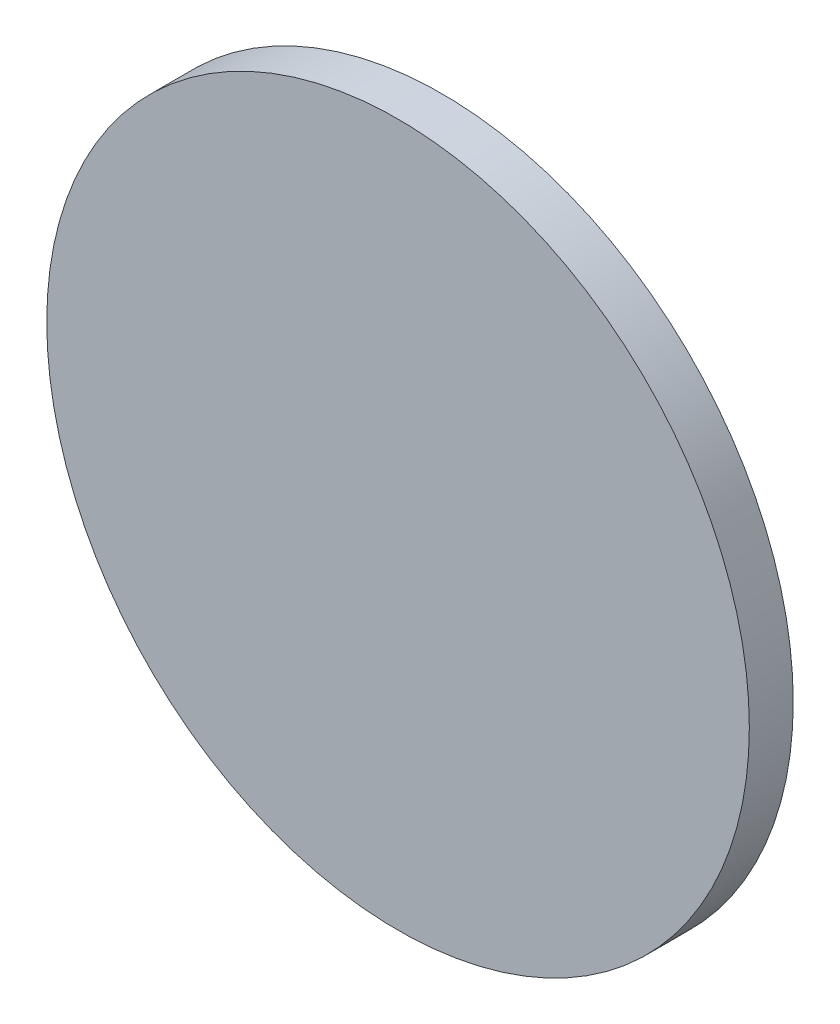
ISO-10303-21;
HEADER;
FILE_DESCRIPTION(('STEP AP214'),'2;1');
FILE_NAME('part.step','',(''),(''),'','','');
FILE_SCHEMA(('AUTOMOTIVE_DESIGN { 1 0 10303 214 1 1 1 1 }'));
ENDSEC;
DATA;
#1=APPLICATION_CONTEXT('core data for automotive mechanical design processes');
#2=APPLICATION_PROTOCOL_DEFINITION('international standard','automotive_design',2000,#1);
#3=PRODUCT_CONTEXT('',#1,'mechanical');
#4=PRODUCT('Part','Part','',(#3));
#5=PRODUCT_RELATED_PRODUCT_CATEGORY('part','',(#4));
#6=PRODUCT_DEFINITION_FORMATION('','',#4);
#7=PRODUCT_DEFINITION_CONTEXT('part definition',#1,'design');
#8=PRODUCT_DEFINITION('design','',#6,#7);
#9=PRODUCT_DEFINITION_SHAPE('','',#8);
#10=(LENGTH_UNIT() NAMED_UNIT(*) SI_UNIT(.MILLI.,.METRE.));
#11=(NAMED_UNIT(*) PLANE_ANGLE_UNIT() SI_UNIT($,.RADIAN.));
#12=(NAMED_UNIT(*) SI_UNIT($,.STERADIAN.) SOLID_ANGLE_UNIT());
#13=UNCERTAINTY_MEASURE_WITH_UNIT(LENGTH_MEASURE(1.E-05),#10,'distance_accuracy_value','');
#14=(GEOMETRIC_REPRESENTATION_CONTEXT(3) GLOBAL_UNCERTAINTY_ASSIGNED_CONTEXT((#13)) GLOBAL_UNIT_ASSIGNED_CONTEXT((#10,
#11,#12)) REPRESENTATION_CONTEXT('',''));
#15=CARTESIAN_POINT('',(0.,0.,0.));
#16=DIRECTION('',(0.,0.,1.));
#17=DIRECTION('',(1.,0.,0.));
#18=AXIS2_PLACEMENT_3D('',#15,#16,#17);
#19=CARTESIAN_POINT('',(0.,0.,-0.5));
#20=DIRECTION('',(0.,0.,1.));
#21=DIRECTION('',(1.,0.,0.));
#22=AXIS2_PLACEMENT_3D('',#19,#20,#21);
#23=CYLINDRICAL_SURFACE('',#22,4.);
#24=CARTESIAN_POINT('',(0.,0.,-0.5));
#25=DIRECTION('',(0.,0.,1.));
#26=DIRECTION('',(1.,0.,0.));
#27=AXIS2_PLACEMENT_3D('',#24,#25,#26);
#28=CIRCLE('',#27,4.);
#29=CARTESIAN_POINT('',(4.,0.,-0.5));
#30=VERTEX_POINT('',#29);
#31=EDGE_CURVE('E10',#30,#30,#28,.T.);
#32=ORIENTED_EDGE('',*,*,#31,.T.);
#33=EDGE_LOOP('',(#32));
#34=FACE_BOUND('',#33,.T.);
#35=CARTESIAN_POINT('',(0.,0.,0.));
#36=DIRECTION('',(0.,0.,1.));
#37=DIRECTION('',(1.,0.,0.));
#38=AXIS2_PLACEMENT_3D('',#35,#36,#37);
#39=CIRCLE('',#38,4.);
#40=CARTESIAN_POINT('',(4.,0.,0.));
#41=VERTEX_POINT('',#40);
#42=EDGE_CURVE('E40',#41,#41,#39,.T.);
#43=ORIENTED_EDGE('',*,*,#42,.F.);
#44=EDGE_LOOP('',(#43));
#45=FACE_BOUND('',#44,.T.);
#46=ADVANCED_FACE('F37',(#34,#45),#23,.T.);
#47=CARTESIAN_POINT('',(0.,0.,-0.5));
#48=DIRECTION('',(0.,0.,1.));
#49=DIRECTION('',(1.,0.,0.));
#50=AXIS2_PLACEMENT_3D('',#47,#48,#49);
#51=PLANE('',#50);
#52=ORIENTED_EDGE('',*,*,#31,.F.);
#53=EDGE_LOOP('',(#52));
#54=FACE_BOUND('',#53,.T.);
#55=ADVANCED_FACE('F54',(#54),#51,.F.);
#56=CARTESIAN_POINT('',(0.,0.,0.));
#57=DIRECTION('',(0.,0.,1.));
#58=DIRECTION('',(1.,0.,0.));
#59=AXIS2_PLACEMENT_3D('',#56,#57,#58);
#60=PLANE('',#59);
#61=ORIENTED_EDGE('',*,*,#42,.T.);
#62=EDGE_LOOP('',(#61));
#63=FACE_BOUND('',#62,.T.);
#64=ADVANCED_FACE('F51',(#63),#60,.T.);
#65=CLOSED_SHELL('',(#46,#55,#64));
#66=MANIFOLD_SOLID_BREP('B2',#65);
#67=ADVANCED_BREP_SHAPE_REPRESENTATION('',(#18,#66),#14);
#68=SHAPE_DEFINITION_REPRESENTATION(#9,#67);
ENDSEC;
END-ISO-10303-21;
